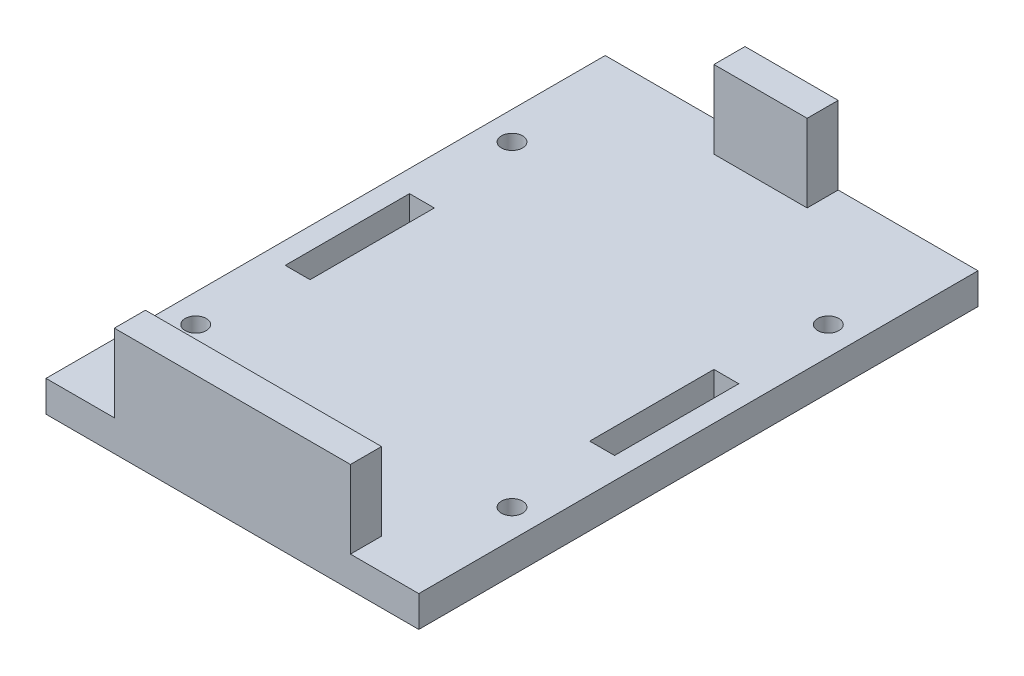
ISO-10303-21;
HEADER;
FILE_DESCRIPTION(('STEP AP214'),'2;1');
FILE_NAME('part.step','',(''),(''),'','','');
FILE_SCHEMA(('AUTOMOTIVE_DESIGN { 1 0 10303 214 1 1 1 1 }'));
ENDSEC;
DATA;
#1=APPLICATION_CONTEXT('core data for automotive mechanical design processes');
#2=APPLICATION_PROTOCOL_DEFINITION('international standard','automotive_design',2000,#1);
#3=PRODUCT_CONTEXT('',#1,'mechanical');
#4=PRODUCT('Part','Part','',(#3));
#5=PRODUCT_RELATED_PRODUCT_CATEGORY('part','',(#4));
#6=PRODUCT_DEFINITION_FORMATION('','',#4);
#7=PRODUCT_DEFINITION_CONTEXT('part definition',#1,'design');
#8=PRODUCT_DEFINITION('design','',#6,#7);
#9=PRODUCT_DEFINITION_SHAPE('','',#8);
#10=(LENGTH_UNIT() NAMED_UNIT(*) SI_UNIT(.MILLI.,.METRE.));
#11=(NAMED_UNIT(*) PLANE_ANGLE_UNIT() SI_UNIT($,.RADIAN.));
#12=(NAMED_UNIT(*) SI_UNIT($,.STERADIAN.) SOLID_ANGLE_UNIT());
#13=UNCERTAINTY_MEASURE_WITH_UNIT(LENGTH_MEASURE(1.E-05),#10,'distance_accuracy_value','');
#14=(GEOMETRIC_REPRESENTATION_CONTEXT(3) GLOBAL_UNCERTAINTY_ASSIGNED_CONTEXT((#13)) GLOBAL_UNIT_ASSIGNED_CONTEXT((#10,
#11,#12)) REPRESENTATION_CONTEXT('',''));
#15=CARTESIAN_POINT('',(0.,0.,0.));
#16=DIRECTION('',(0.,0.,1.));
#17=DIRECTION('',(1.,0.,0.));
#18=AXIS2_PLACEMENT_3D('',#15,#16,#17);
#19=CARTESIAN_POINT('',(0.,2.5,0.));
#20=DIRECTION('',(0.,-1.,0.));
#21=DIRECTION('',(0.,0.,-1.));
#22=AXIS2_PLACEMENT_3D('',#19,#20,#21);
#23=PLANE('',#22);
#24=CARTESIAN_POINT('',(25.4558441227157,2.5,-25.4558441227157));
#25=DIRECTION('',(0.,1.,0.));
#26=DIRECTION('',(0.,0.,1.));
#27=AXIS2_PLACEMENT_3D('',#24,#25,#26);
#28=CIRCLE('',#27,1.69999999999999);
#29=CARTESIAN_POINT('',(25.4558441227157,2.5,-23.7558441227157));
#30=VERTEX_POINT('',#29);
#31=EDGE_CURVE('E272',#30,#30,#28,.T.);
#32=ORIENTED_EDGE('',*,*,#31,.F.);
#33=EDGE_LOOP('',(#32));
#34=FACE_BOUND('',#33,.T.);
#35=DIRECTION('',(0.,0.,1.));
#36=VECTOR('',#35,1.);
#37=CARTESIAN_POINT('',(-26.5,2.5,-10.));
#38=LINE('',#37,#36);
#39=CARTESIAN_POINT('',(-26.5,2.5,-10.));
#40=VERTEX_POINT('',#39);
#41=CARTESIAN_POINT('',(-26.5,2.5,10.));
#42=VERTEX_POINT('',#41);
#43=EDGE_CURVE('E324',#40,#42,#38,.T.);
#44=ORIENTED_EDGE('',*,*,#43,.F.);
#45=DIRECTION('',(-1.,0.,0.));
#46=VECTOR('',#45,1.);
#47=CARTESIAN_POINT('',(-26.5,2.5,-10.));
#48=LINE('',#47,#46);
#49=CARTESIAN_POINT('',(-22.5,2.5,-10.));
#50=VERTEX_POINT('',#49);
#51=EDGE_CURVE('E335',#50,#40,#48,.T.);
#52=ORIENTED_EDGE('',*,*,#51,.F.);
#53=DIRECTION('',(0.,0.,-1.));
#54=VECTOR('',#53,1.);
#55=CARTESIAN_POINT('',(-22.5,2.5,-10.));
#56=LINE('',#55,#54);
#57=CARTESIAN_POINT('',(-22.5,2.5,10.));
#58=VERTEX_POINT('',#57);
#59=EDGE_CURVE('E331',#58,#50,#56,.T.);
#60=ORIENTED_EDGE('',*,*,#59,.F.);
#61=DIRECTION('',(1.,0.,0.));
#62=VECTOR('',#61,1.);
#63=CARTESIAN_POINT('',(-26.5,2.5,10.));
#64=LINE('',#63,#62);
#65=EDGE_CURVE('E327',#42,#58,#64,.T.);
#66=ORIENTED_EDGE('',*,*,#65,.F.);
#67=EDGE_LOOP('',(#44,#52,#60,#66));
#68=FACE_BOUND('',#67,.T.);
#69=DIRECTION('',(0.,0.,-1.));
#70=VECTOR('',#69,1.);
#71=CARTESIAN_POINT('',(26.5,2.5,-10.));
#72=LINE('',#71,#70);
#73=CARTESIAN_POINT('',(26.5,2.5,10.));
#74=VERTEX_POINT('',#73);
#75=CARTESIAN_POINT('',(26.5,2.5,-10.));
#76=VERTEX_POINT('',#75);
#77=EDGE_CURVE('E281',#74,#76,#72,.T.);
#78=ORIENTED_EDGE('',*,*,#77,.F.);
#79=DIRECTION('',(1.,0.,0.));
#80=VECTOR('',#79,1.);
#81=CARTESIAN_POINT('',(26.5,2.5,10.));
#82=LINE('',#81,#80);
#83=CARTESIAN_POINT('',(22.5,2.5,10.));
#84=VERTEX_POINT('',#83);
#85=EDGE_CURVE('E292',#84,#74,#82,.T.);
#86=ORIENTED_EDGE('',*,*,#85,.F.);
#87=DIRECTION('',(0.,0.,1.));
#88=VECTOR('',#87,1.);
#89=CARTESIAN_POINT('',(22.5,2.5,-10.));
#90=LINE('',#89,#88);
#91=CARTESIAN_POINT('',(22.5,2.5,-10.));
#92=VERTEX_POINT('',#91);
#93=EDGE_CURVE('E288',#92,#84,#90,.T.);
#94=ORIENTED_EDGE('',*,*,#93,.F.);
#95=DIRECTION('',(-1.,0.,0.));
#96=VECTOR('',#95,1.);
#97=CARTESIAN_POINT('',(26.5,2.5,-10.));
#98=LINE('',#97,#96);
#99=EDGE_CURVE('E284',#76,#92,#98,.T.);
#100=ORIENTED_EDGE('',*,*,#99,.F.);
#101=EDGE_LOOP('',(#78,#86,#94,#100));
#102=FACE_BOUND('',#101,.T.);
#103=CARTESIAN_POINT('',(-25.4558441227157,2.5,-25.4558441227157));
#104=DIRECTION('',(0.,1.,0.));
#105=DIRECTION('',(0.,0.,1.));
#106=AXIS2_PLACEMENT_3D('',#103,#104,#105);
#107=CIRCLE('',#106,1.69999999999999);
#108=CARTESIAN_POINT('',(-25.4558441227157,2.5,-23.7558441227157));
#109=VERTEX_POINT('',#108);
#110=EDGE_CURVE('E264',#109,#109,#107,.T.);
#111=ORIENTED_EDGE('',*,*,#110,.F.);
#112=EDGE_LOOP('',(#111));
#113=FACE_BOUND('',#112,.T.);
#114=CARTESIAN_POINT('',(-25.4558441227157,2.5,25.4558441227157));
#115=DIRECTION('',(0.,1.,0.));
#116=DIRECTION('',(0.,0.,1.));
#117=AXIS2_PLACEMENT_3D('',#114,#115,#116);
#118=CIRCLE('',#117,1.69999999999999);
#119=CARTESIAN_POINT('',(-25.4558441227157,2.5,27.1558441227157));
#120=VERTEX_POINT('',#119);
#121=EDGE_CURVE('E256',#120,#120,#118,.T.);
#122=ORIENTED_EDGE('',*,*,#121,.F.);
#123=EDGE_LOOP('',(#122));
#124=FACE_BOUND('',#123,.T.);
#125=CARTESIAN_POINT('',(25.4558441227157,2.5,25.4558441227157));
#126=DIRECTION('',(0.,1.,0.));
#127=DIRECTION('',(0.,0.,1.));
#128=AXIS2_PLACEMENT_3D('',#125,#126,#127);
#129=CIRCLE('',#128,1.69999999999999);
#130=CARTESIAN_POINT('',(25.4558441227157,2.5,27.1558441227157));
#131=VERTEX_POINT('',#130);
#132=EDGE_CURVE('E248',#131,#131,#129,.T.);
#133=ORIENTED_EDGE('',*,*,#132,.F.);
#134=EDGE_LOOP('',(#133));
#135=FACE_BOUND('',#134,.T.);
#136=DIRECTION('',(0.,0.,1.));
#137=VECTOR('',#136,1.);
#138=CARTESIAN_POINT('',(-7.5,2.5,-40.));
#139=LINE('',#138,#137);
#140=CARTESIAN_POINT('',(-7.5,2.5,-45.));
#141=VERTEX_POINT('',#140);
#142=CARTESIAN_POINT('',(-7.5,2.5,-40.));
#143=VERTEX_POINT('',#142);
#144=EDGE_CURVE('E199',#141,#143,#139,.T.);
#145=ORIENTED_EDGE('',*,*,#144,.F.);
#146=DIRECTION('',(-1.,0.,0.));
#147=VECTOR('',#146,1.);
#148=CARTESIAN_POINT('',(-30.,2.5,-45.));
#149=LINE('',#148,#147);
#150=CARTESIAN_POINT('',(-30.,2.5,-45.));
#151=VERTEX_POINT('',#150);
#152=EDGE_CURVE('E371',#141,#151,#149,.T.);
#153=ORIENTED_EDGE('',*,*,#152,.T.);
#154=DIRECTION('',(0.,0.,1.));
#155=VECTOR('',#154,1.);
#156=CARTESIAN_POINT('',(-30.,2.5,45.));
#157=LINE('',#156,#155);
#158=CARTESIAN_POINT('',(-30.,2.5,45.));
#159=VERTEX_POINT('',#158);
#160=EDGE_CURVE('E376',#151,#159,#157,.T.);
#161=ORIENTED_EDGE('',*,*,#160,.T.);
#162=DIRECTION('',(1.,0.,0.));
#163=VECTOR('',#162,1.);
#164=CARTESIAN_POINT('',(-30.,2.5,45.));
#165=LINE('',#164,#163);
#166=CARTESIAN_POINT('',(-19.,2.5,45.));
#167=VERTEX_POINT('',#166);
#168=EDGE_CURVE('E380',#159,#167,#165,.T.);
#169=ORIENTED_EDGE('',*,*,#168,.T.);
#170=DIRECTION('',(0.,0.,1.));
#171=VECTOR('',#170,1.);
#172=CARTESIAN_POINT('',(-19.,2.5,40.));
#173=LINE('',#172,#171);
#174=CARTESIAN_POINT('',(-19.,2.5,40.));
#175=VERTEX_POINT('',#174);
#176=EDGE_CURVE('E201',#175,#167,#173,.T.);
#177=ORIENTED_EDGE('',*,*,#176,.F.);
#178=DIRECTION('',(-1.,0.,0.));
#179=VECTOR('',#178,1.);
#180=CARTESIAN_POINT('',(-19.,2.5,40.));
#181=LINE('',#180,#179);
#182=CARTESIAN_POINT('',(19.,2.5,40.));
#183=VERTEX_POINT('',#182);
#184=EDGE_CURVE('E217',#183,#175,#181,.T.);
#185=ORIENTED_EDGE('',*,*,#184,.F.);
#186=DIRECTION('',(0.,0.,-1.));
#187=VECTOR('',#186,1.);
#188=CARTESIAN_POINT('',(19.,2.5,40.));
#189=LINE('',#188,#187);
#190=CARTESIAN_POINT('',(19.,2.5,45.));
#191=VERTEX_POINT('',#190);
#192=EDGE_CURVE('E206',#191,#183,#189,.T.);
#193=ORIENTED_EDGE('',*,*,#192,.F.);
#194=CARTESIAN_POINT('',(30.,2.5,45.));
#195=VERTEX_POINT('',#194);
#196=EDGE_CURVE('E379',#191,#195,#165,.T.);
#197=ORIENTED_EDGE('',*,*,#196,.T.);
#198=DIRECTION('',(0.,0.,-1.));
#199=VECTOR('',#198,1.);
#200=CARTESIAN_POINT('',(30.,2.5,45.));
#201=LINE('',#200,#199);
#202=CARTESIAN_POINT('',(30.,2.5,-45.));
#203=VERTEX_POINT('',#202);
#204=EDGE_CURVE('E367',#195,#203,#201,.T.);
#205=ORIENTED_EDGE('',*,*,#204,.T.);
#206=CARTESIAN_POINT('',(7.49999999999998,2.5,-45.));
#207=VERTEX_POINT('',#206);
#208=EDGE_CURVE('E373',#203,#207,#149,.T.);
#209=ORIENTED_EDGE('',*,*,#208,.T.);
#210=DIRECTION('',(0.,0.,-1.));
#211=VECTOR('',#210,1.);
#212=CARTESIAN_POINT('',(7.5,2.5,-40.));
#213=LINE('',#212,#211);
#214=CARTESIAN_POINT('',(7.5,2.5,-40.));
#215=VERTEX_POINT('',#214);
#216=EDGE_CURVE('E60',#215,#207,#213,.T.);
#217=ORIENTED_EDGE('',*,*,#216,.F.);
#218=DIRECTION('',(1.,0.,0.));
#219=VECTOR('',#218,1.);
#220=CARTESIAN_POINT('',(-7.5,2.5,-40.));
#221=LINE('',#220,#219);
#222=EDGE_CURVE('E55',#143,#215,#221,.T.);
#223=ORIENTED_EDGE('',*,*,#222,.F.);
#224=EDGE_LOOP('',(#145,#153,#161,#169,#177,#185,#193,#197,#205,#209,#217,#223));
#225=FACE_BOUND('',#224,.T.);
#226=ADVANCED_FACE('F39',(#34,#68,#102,#113,#124,#135,#225),#23,.F.);
#227=CARTESIAN_POINT('',(0.,-2.5,0.));
#228=DIRECTION('',(0.,-1.,0.));
#229=DIRECTION('',(0.,0.,-1.));
#230=AXIS2_PLACEMENT_3D('',#227,#228,#229);
#231=PLANE('',#230);
#232=CARTESIAN_POINT('',(25.4558441227157,-2.5,25.4558441227157));
#233=DIRECTION('',(0.,-1.,0.));
#234=DIRECTION('',(0.,0.,-1.));
#235=AXIS2_PLACEMENT_3D('',#232,#233,#234);
#236=CIRCLE('',#235,1.69999999999999);
#237=CARTESIAN_POINT('',(25.4558441227157,-2.5,23.7558441227157));
#238=VERTEX_POINT('',#237);
#239=EDGE_CURVE('E252',#238,#238,#236,.T.);
#240=ORIENTED_EDGE('',*,*,#239,.F.);
#241=EDGE_LOOP('',(#240));
#242=FACE_BOUND('',#241,.T.);
#243=CARTESIAN_POINT('',(-25.4558441227157,-2.5,25.4558441227157));
#244=DIRECTION('',(0.,-1.,0.));
#245=DIRECTION('',(0.,0.,-1.));
#246=AXIS2_PLACEMENT_3D('',#243,#244,#245);
#247=CIRCLE('',#246,1.69999999999999);
#248=CARTESIAN_POINT('',(-25.4558441227157,-2.5,23.7558441227157));
#249=VERTEX_POINT('',#248);
#250=EDGE_CURVE('E260',#249,#249,#247,.T.);
#251=ORIENTED_EDGE('',*,*,#250,.F.);
#252=EDGE_LOOP('',(#251));
#253=FACE_BOUND('',#252,.T.);
#254=CARTESIAN_POINT('',(-25.4558441227157,-2.5,-25.4558441227157));
#255=DIRECTION('',(0.,-1.,0.));
#256=DIRECTION('',(0.,0.,-1.));
#257=AXIS2_PLACEMENT_3D('',#254,#255,#256);
#258=CIRCLE('',#257,1.69999999999999);
#259=CARTESIAN_POINT('',(-25.4558441227157,-2.5,-27.1558441227157));
#260=VERTEX_POINT('',#259);
#261=EDGE_CURVE('E268',#260,#260,#258,.T.);
#262=ORIENTED_EDGE('',*,*,#261,.F.);
#263=EDGE_LOOP('',(#262));
#264=FACE_BOUND('',#263,.T.);
#265=CARTESIAN_POINT('',(25.4558441227157,-2.5,-25.4558441227157));
#266=DIRECTION('',(0.,-1.,0.));
#267=DIRECTION('',(0.,0.,-1.));
#268=AXIS2_PLACEMENT_3D('',#265,#266,#267);
#269=CIRCLE('',#268,1.69999999999999);
#270=CARTESIAN_POINT('',(25.4558441227157,-2.5,-27.1558441227157));
#271=VERTEX_POINT('',#270);
#272=EDGE_CURVE('E276',#271,#271,#269,.T.);
#273=ORIENTED_EDGE('',*,*,#272,.F.);
#274=EDGE_LOOP('',(#273));
#275=FACE_BOUND('',#274,.T.);
#276=DIRECTION('',(0.,0.,-1.));
#277=VECTOR('',#276,1.);
#278=CARTESIAN_POINT('',(30.,-2.5,45.));
#279=LINE('',#278,#277);
#280=CARTESIAN_POINT('',(30.,-2.5,45.));
#281=VERTEX_POINT('',#280);
#282=CARTESIAN_POINT('',(30.,-2.5,-45.));
#283=VERTEX_POINT('',#282);
#284=EDGE_CURVE('E366',#281,#283,#279,.T.);
#285=ORIENTED_EDGE('',*,*,#284,.F.);
#286=DIRECTION('',(1.,0.,0.));
#287=VECTOR('',#286,1.);
#288=CARTESIAN_POINT('',(-30.,-2.5,45.));
#289=LINE('',#288,#287);
#290=CARTESIAN_POINT('',(-30.,-2.5,45.));
#291=VERTEX_POINT('',#290);
#292=EDGE_CURVE('E372',#291,#281,#289,.T.);
#293=ORIENTED_EDGE('',*,*,#292,.F.);
#294=DIRECTION('',(0.,0.,1.));
#295=VECTOR('',#294,1.);
#296=CARTESIAN_POINT('',(-30.,-2.5,45.));
#297=LINE('',#296,#295);
#298=CARTESIAN_POINT('',(-30.,-2.5,-45.));
#299=VERTEX_POINT('',#298);
#300=EDGE_CURVE('E390',#299,#291,#297,.T.);
#301=ORIENTED_EDGE('',*,*,#300,.F.);
#302=DIRECTION('',(-1.,0.,0.));
#303=VECTOR('',#302,1.);
#304=CARTESIAN_POINT('',(-30.,-2.5,-45.));
#305=LINE('',#304,#303);
#306=EDGE_CURVE('E387',#283,#299,#305,.T.);
#307=ORIENTED_EDGE('',*,*,#306,.F.);
#308=EDGE_LOOP('',(#285,#293,#301,#307));
#309=FACE_BOUND('',#308,.T.);
#310=DIRECTION('',(-1.,0.,0.));
#311=VECTOR('',#310,1.);
#312=CARTESIAN_POINT('',(-26.5,-2.5,-10.));
#313=LINE('',#312,#311);
#314=CARTESIAN_POINT('',(-22.5,-2.5,-10.));
#315=VERTEX_POINT('',#314);
#316=CARTESIAN_POINT('',(-26.5,-2.5,-10.));
#317=VERTEX_POINT('',#316);
#318=EDGE_CURVE('E328',#315,#317,#313,.T.);
#319=ORIENTED_EDGE('',*,*,#318,.T.);
#320=DIRECTION('',(0.,0.,1.));
#321=VECTOR('',#320,1.);
#322=CARTESIAN_POINT('',(-26.5,-2.5,-10.));
#323=LINE('',#322,#321);
#324=CARTESIAN_POINT('',(-26.5,-2.5,10.));
#325=VERTEX_POINT('',#324);
#326=EDGE_CURVE('E323',#317,#325,#323,.T.);
#327=ORIENTED_EDGE('',*,*,#326,.T.);
#328=DIRECTION('',(1.,0.,0.));
#329=VECTOR('',#328,1.);
#330=CARTESIAN_POINT('',(-26.5,-2.5,10.));
#331=LINE('',#330,#329);
#332=CARTESIAN_POINT('',(-22.5,-2.5,10.));
#333=VERTEX_POINT('',#332);
#334=EDGE_CURVE('E342',#325,#333,#331,.T.);
#335=ORIENTED_EDGE('',*,*,#334,.T.);
#336=DIRECTION('',(0.,0.,-1.));
#337=VECTOR('',#336,1.);
#338=CARTESIAN_POINT('',(-22.5,-2.5,-10.));
#339=LINE('',#338,#337);
#340=EDGE_CURVE('E346',#333,#315,#339,.T.);
#341=ORIENTED_EDGE('',*,*,#340,.T.);
#342=EDGE_LOOP('',(#319,#327,#335,#341));
#343=FACE_BOUND('',#342,.T.);
#344=DIRECTION('',(1.,0.,0.));
#345=VECTOR('',#344,1.);
#346=CARTESIAN_POINT('',(26.5,-2.5,10.));
#347=LINE('',#346,#345);
#348=CARTESIAN_POINT('',(22.5,-2.5,10.));
#349=VERTEX_POINT('',#348);
#350=CARTESIAN_POINT('',(26.5,-2.5,10.));
#351=VERTEX_POINT('',#350);
#352=EDGE_CURVE('E285',#349,#351,#347,.T.);
#353=ORIENTED_EDGE('',*,*,#352,.T.);
#354=DIRECTION('',(0.,0.,-1.));
#355=VECTOR('',#354,1.);
#356=CARTESIAN_POINT('',(26.5,-2.5,-10.));
#357=LINE('',#356,#355);
#358=CARTESIAN_POINT('',(26.5,-2.5,-10.));
#359=VERTEX_POINT('',#358);
#360=EDGE_CURVE('E280',#351,#359,#357,.T.);
#361=ORIENTED_EDGE('',*,*,#360,.T.);
#362=DIRECTION('',(-1.,0.,0.));
#363=VECTOR('',#362,1.);
#364=CARTESIAN_POINT('',(26.5,-2.5,-10.));
#365=LINE('',#364,#363);
#366=CARTESIAN_POINT('',(22.5,-2.5,-10.));
#367=VERTEX_POINT('',#366);
#368=EDGE_CURVE('E299',#359,#367,#365,.T.);
#369=ORIENTED_EDGE('',*,*,#368,.T.);
#370=DIRECTION('',(0.,0.,1.));
#371=VECTOR('',#370,1.);
#372=CARTESIAN_POINT('',(22.5,-2.5,-10.));
#373=LINE('',#372,#371);
#374=EDGE_CURVE('E303',#367,#349,#373,.T.);
#375=ORIENTED_EDGE('',*,*,#374,.T.);
#376=EDGE_LOOP('',(#353,#361,#369,#375));
#377=FACE_BOUND('',#376,.T.);
#378=ADVANCED_FACE('F413',(#242,#253,#264,#275,#309,#343,#377),#231,.T.);
#379=CARTESIAN_POINT('',(30.,2.5,45.));
#380=DIRECTION('',(-1.,0.,0.));
#381=DIRECTION('',(0.,0.,1.));
#382=AXIS2_PLACEMENT_3D('',#379,#380,#381);
#383=PLANE('',#382);
#384=ORIENTED_EDGE('',*,*,#284,.T.);
#385=DIRECTION('',(0.,-1.,0.));
#386=VECTOR('',#385,1.);
#387=CARTESIAN_POINT('',(30.,2.5,-45.));
#388=LINE('',#387,#386);
#389=EDGE_CURVE('E11',#203,#283,#388,.T.);
#390=ORIENTED_EDGE('',*,*,#389,.F.);
#391=ORIENTED_EDGE('',*,*,#204,.F.);
#392=DIRECTION('',(0.,-1.,0.));
#393=VECTOR('',#392,1.);
#394=CARTESIAN_POINT('',(30.,2.5,45.));
#395=LINE('',#394,#393);
#396=EDGE_CURVE('E383',#195,#281,#395,.T.);
#397=ORIENTED_EDGE('',*,*,#396,.T.);
#398=EDGE_LOOP('',(#384,#390,#391,#397));
#399=FACE_BOUND('',#398,.T.);
#400=ADVANCED_FACE('F41',(#399),#383,.F.);
#401=CARTESIAN_POINT('',(-30.,2.5,-45.));
#402=DIRECTION('',(0.,0.,1.));
#403=DIRECTION('',(1.,0.,0.));
#404=AXIS2_PLACEMENT_3D('',#401,#402,#403);
#405=PLANE('',#404);
#406=ORIENTED_EDGE('',*,*,#306,.T.);
#407=DIRECTION('',(0.,-1.,0.));
#408=VECTOR('',#407,1.);
#409=CARTESIAN_POINT('',(-30.,2.5,-45.));
#410=LINE('',#409,#408);
#411=EDGE_CURVE('E48',#151,#299,#410,.T.);
#412=ORIENTED_EDGE('',*,*,#411,.F.);
#413=ORIENTED_EDGE('',*,*,#152,.F.);
#414=DIRECTION('',(0.,-1.,0.));
#415=VECTOR('',#414,1.);
#416=CARTESIAN_POINT('',(-7.5,15.,-45.));
#417=LINE('',#416,#415);
#418=CARTESIAN_POINT('',(-7.5,15.,-45.));
#419=VERTEX_POINT('',#418);
#420=EDGE_CURVE('E427',#419,#141,#417,.T.);
#421=ORIENTED_EDGE('',*,*,#420,.F.);
#422=DIRECTION('',(-1.,0.,0.));
#423=VECTOR('',#422,1.);
#424=CARTESIAN_POINT('',(-7.5,15.,-45.));
#425=LINE('',#424,#423);
#426=CARTESIAN_POINT('',(7.5,15.,-45.));
#427=VERTEX_POINT('',#426);
#428=EDGE_CURVE('E192',#427,#419,#425,.T.);
#429=ORIENTED_EDGE('',*,*,#428,.F.);
#430=DIRECTION('',(0.,-1.,0.));
#431=VECTOR('',#430,1.);
#432=CARTESIAN_POINT('',(7.5,15.,-45.));
#433=LINE('',#432,#431);
#434=EDGE_CURVE('E208',#427,#207,#433,.T.);
#435=ORIENTED_EDGE('',*,*,#434,.T.);
#436=ORIENTED_EDGE('',*,*,#208,.F.);
#437=ORIENTED_EDGE('',*,*,#389,.T.);
#438=EDGE_LOOP('',(#406,#412,#413,#421,#429,#435,#436,#437));
#439=FACE_BOUND('',#438,.T.);
#440=ADVANCED_FACE('F426',(#439),#405,.F.);
#441=CARTESIAN_POINT('',(-30.,2.5,45.));
#442=DIRECTION('',(1.,0.,0.));
#443=DIRECTION('',(0.,0.,-1.));
#444=AXIS2_PLACEMENT_3D('',#441,#442,#443);
#445=PLANE('',#444);
#446=ORIENTED_EDGE('',*,*,#300,.T.);
#447=DIRECTION('',(0.,-1.,0.));
#448=VECTOR('',#447,1.);
#449=CARTESIAN_POINT('',(-30.,2.5,45.));
#450=LINE('',#449,#448);
#451=EDGE_CURVE('E398',#159,#291,#450,.T.);
#452=ORIENTED_EDGE('',*,*,#451,.F.);
#453=ORIENTED_EDGE('',*,*,#160,.F.);
#454=ORIENTED_EDGE('',*,*,#411,.T.);
#455=EDGE_LOOP('',(#446,#452,#453,#454));
#456=FACE_BOUND('',#455,.T.);
#457=ADVANCED_FACE('F407',(#456),#445,.F.);
#458=CARTESIAN_POINT('',(-30.,2.5,45.));
#459=DIRECTION('',(0.,0.,-1.));
#460=DIRECTION('',(-1.,0.,0.));
#461=AXIS2_PLACEMENT_3D('',#458,#459,#460);
#462=PLANE('',#461);
#463=ORIENTED_EDGE('',*,*,#292,.T.);
#464=ORIENTED_EDGE('',*,*,#396,.F.);
#465=ORIENTED_EDGE('',*,*,#196,.F.);
#466=DIRECTION('',(0.,-1.,0.));
#467=VECTOR('',#466,1.);
#468=CARTESIAN_POINT('',(19.,15.,45.));
#469=LINE('',#468,#467);
#470=CARTESIAN_POINT('',(19.,15.,45.));
#471=VERTEX_POINT('',#470);
#472=EDGE_CURVE('E240',#471,#191,#469,.T.);
#473=ORIENTED_EDGE('',*,*,#472,.F.);
#474=DIRECTION('',(1.,0.,0.));
#475=VECTOR('',#474,1.);
#476=CARTESIAN_POINT('',(-19.,15.,45.));
#477=LINE('',#476,#475);
#478=CARTESIAN_POINT('',(-19.,15.,45.));
#479=VERTEX_POINT('',#478);
#480=EDGE_CURVE('E216',#479,#471,#477,.T.);
#481=ORIENTED_EDGE('',*,*,#480,.F.);
#482=DIRECTION('',(0.,-1.,0.));
#483=VECTOR('',#482,1.);
#484=CARTESIAN_POINT('',(-19.,15.,45.));
#485=LINE('',#484,#483);
#486=EDGE_CURVE('E244',#479,#167,#485,.T.);
#487=ORIENTED_EDGE('',*,*,#486,.T.);
#488=ORIENTED_EDGE('',*,*,#168,.F.);
#489=ORIENTED_EDGE('',*,*,#451,.T.);
#490=EDGE_LOOP('',(#463,#464,#465,#473,#481,#487,#488,#489));
#491=FACE_BOUND('',#490,.T.);
#492=ADVANCED_FACE('F417',(#491),#462,.F.);
#493=CARTESIAN_POINT('',(-26.5,2.5,-10.));
#494=DIRECTION('',(1.,0.,0.));
#495=DIRECTION('',(0.,0.,-1.));
#496=AXIS2_PLACEMENT_3D('',#493,#494,#495);
#497=PLANE('',#496);
#498=ORIENTED_EDGE('',*,*,#326,.F.);
#499=DIRECTION('',(0.,-1.,0.));
#500=VECTOR('',#499,1.);
#501=CARTESIAN_POINT('',(-26.5,2.5,-10.));
#502=LINE('',#501,#500);
#503=EDGE_CURVE('E338',#40,#317,#502,.T.);
#504=ORIENTED_EDGE('',*,*,#503,.F.);
#505=ORIENTED_EDGE('',*,*,#43,.T.);
#506=DIRECTION('',(0.,-1.,0.));
#507=VECTOR('',#506,1.);
#508=CARTESIAN_POINT('',(-26.5,2.5,10.));
#509=LINE('',#508,#507);
#510=EDGE_CURVE('E362',#42,#325,#509,.T.);
#511=ORIENTED_EDGE('',*,*,#510,.T.);
#512=EDGE_LOOP('',(#498,#504,#505,#511));
#513=FACE_BOUND('',#512,.T.);
#514=ADVANCED_FACE('F464',(#513),#497,.T.);
#515=CARTESIAN_POINT('',(-26.5,2.5,10.));
#516=DIRECTION('',(0.,0.,-1.));
#517=DIRECTION('',(-1.,0.,0.));
#518=AXIS2_PLACEMENT_3D('',#515,#516,#517);
#519=PLANE('',#518);
#520=ORIENTED_EDGE('',*,*,#334,.F.);
#521=ORIENTED_EDGE('',*,*,#510,.F.);
#522=ORIENTED_EDGE('',*,*,#65,.T.);
#523=DIRECTION('',(0.,-1.,0.));
#524=VECTOR('',#523,1.);
#525=CARTESIAN_POINT('',(-22.5,2.5,10.));
#526=LINE('',#525,#524);
#527=EDGE_CURVE('E359',#58,#333,#526,.T.);
#528=ORIENTED_EDGE('',*,*,#527,.T.);
#529=EDGE_LOOP('',(#520,#521,#522,#528));
#530=FACE_BOUND('',#529,.T.);
#531=ADVANCED_FACE('F633',(#530),#519,.T.);
#532=CARTESIAN_POINT('',(-22.5,2.5,-10.));
#533=DIRECTION('',(-1.,0.,0.));
#534=DIRECTION('',(0.,0.,1.));
#535=AXIS2_PLACEMENT_3D('',#532,#533,#534);
#536=PLANE('',#535);
#537=ORIENTED_EDGE('',*,*,#340,.F.);
#538=ORIENTED_EDGE('',*,*,#527,.F.);
#539=ORIENTED_EDGE('',*,*,#59,.T.);
#540=DIRECTION('',(0.,-1.,0.));
#541=VECTOR('',#540,1.);
#542=CARTESIAN_POINT('',(-22.5,2.5,-10.));
#543=LINE('',#542,#541);
#544=EDGE_CURVE('E356',#50,#315,#543,.T.);
#545=ORIENTED_EDGE('',*,*,#544,.T.);
#546=EDGE_LOOP('',(#537,#538,#539,#545));
#547=FACE_BOUND('',#546,.T.);
#548=ADVANCED_FACE('F630',(#547),#536,.T.);
#549=CARTESIAN_POINT('',(-26.5,2.5,-10.));
#550=DIRECTION('',(0.,0.,1.));
#551=DIRECTION('',(1.,0.,0.));
#552=AXIS2_PLACEMENT_3D('',#549,#550,#551);
#553=PLANE('',#552);
#554=ORIENTED_EDGE('',*,*,#318,.F.);
#555=ORIENTED_EDGE('',*,*,#544,.F.);
#556=ORIENTED_EDGE('',*,*,#51,.T.);
#557=ORIENTED_EDGE('',*,*,#503,.T.);
#558=EDGE_LOOP('',(#554,#555,#556,#557));
#559=FACE_BOUND('',#558,.T.);
#560=ADVANCED_FACE('F626',(#559),#553,.T.);
#561=CARTESIAN_POINT('',(26.5,2.5,-10.));
#562=DIRECTION('',(-1.,0.,0.));
#563=DIRECTION('',(0.,0.,1.));
#564=AXIS2_PLACEMENT_3D('',#561,#562,#563);
#565=PLANE('',#564);
#566=ORIENTED_EDGE('',*,*,#360,.F.);
#567=DIRECTION('',(0.,-1.,0.));
#568=VECTOR('',#567,1.);
#569=CARTESIAN_POINT('',(26.5,2.5,10.));
#570=LINE('',#569,#568);
#571=EDGE_CURVE('E295',#74,#351,#570,.T.);
#572=ORIENTED_EDGE('',*,*,#571,.F.);
#573=ORIENTED_EDGE('',*,*,#77,.T.);
#574=DIRECTION('',(0.,-1.,0.));
#575=VECTOR('',#574,1.);
#576=CARTESIAN_POINT('',(26.5,2.5,-10.));
#577=LINE('',#576,#575);
#578=EDGE_CURVE('E319',#76,#359,#577,.T.);
#579=ORIENTED_EDGE('',*,*,#578,.T.);
#580=EDGE_LOOP('',(#566,#572,#573,#579));
#581=FACE_BOUND('',#580,.T.);
#582=ADVANCED_FACE('F622',(#581),#565,.T.);
#583=CARTESIAN_POINT('',(26.5,2.5,-10.));
#584=DIRECTION('',(0.,0.,1.));
#585=DIRECTION('',(1.,0.,0.));
#586=AXIS2_PLACEMENT_3D('',#583,#584,#585);
#587=PLANE('',#586);
#588=ORIENTED_EDGE('',*,*,#368,.F.);
#589=ORIENTED_EDGE('',*,*,#578,.F.);
#590=ORIENTED_EDGE('',*,*,#99,.T.);
#591=DIRECTION('',(0.,-1.,0.));
#592=VECTOR('',#591,1.);
#593=CARTESIAN_POINT('',(22.5,2.5,-10.));
#594=LINE('',#593,#592);
#595=EDGE_CURVE('E316',#92,#367,#594,.T.);
#596=ORIENTED_EDGE('',*,*,#595,.T.);
#597=EDGE_LOOP('',(#588,#589,#590,#596));
#598=FACE_BOUND('',#597,.T.);
#599=ADVANCED_FACE('F618',(#598),#587,.T.);
#600=CARTESIAN_POINT('',(22.5,2.5,-10.));
#601=DIRECTION('',(1.,0.,0.));
#602=DIRECTION('',(0.,0.,-1.));
#603=AXIS2_PLACEMENT_3D('',#600,#601,#602);
#604=PLANE('',#603);
#605=ORIENTED_EDGE('',*,*,#374,.F.);
#606=ORIENTED_EDGE('',*,*,#595,.F.);
#607=ORIENTED_EDGE('',*,*,#93,.T.);
#608=DIRECTION('',(0.,-1.,0.));
#609=VECTOR('',#608,1.);
#610=CARTESIAN_POINT('',(22.5,2.5,10.));
#611=LINE('',#610,#609);
#612=EDGE_CURVE('E313',#84,#349,#611,.T.);
#613=ORIENTED_EDGE('',*,*,#612,.T.);
#614=EDGE_LOOP('',(#605,#606,#607,#613));
#615=FACE_BOUND('',#614,.T.);
#616=ADVANCED_FACE('F614',(#615),#604,.T.);
#617=CARTESIAN_POINT('',(26.5,2.5,10.));
#618=DIRECTION('',(0.,0.,-1.));
#619=DIRECTION('',(-1.,0.,0.));
#620=AXIS2_PLACEMENT_3D('',#617,#618,#619);
#621=PLANE('',#620);
#622=ORIENTED_EDGE('',*,*,#352,.F.);
#623=ORIENTED_EDGE('',*,*,#612,.F.);
#624=ORIENTED_EDGE('',*,*,#85,.T.);
#625=ORIENTED_EDGE('',*,*,#571,.T.);
#626=EDGE_LOOP('',(#622,#623,#624,#625));
#627=FACE_BOUND('',#626,.T.);
#628=ADVANCED_FACE('F487',(#627),#621,.T.);
#629=CARTESIAN_POINT('',(25.4558441227157,2.5,-25.4558441227157));
#630=DIRECTION('',(0.,1.,0.));
#631=DIRECTION('',(0.,0.,1.));
#632=AXIS2_PLACEMENT_3D('',#629,#630,#631);
#633=CYLINDRICAL_SURFACE('',#632,1.69999999999999);
#634=ORIENTED_EDGE('',*,*,#31,.T.);
#635=EDGE_LOOP('',(#634));
#636=FACE_BOUND('',#635,.T.);
#637=ORIENTED_EDGE('',*,*,#272,.T.);
#638=EDGE_LOOP('',(#637));
#639=FACE_BOUND('',#638,.T.);
#640=ADVANCED_FACE('F492',(#636,#639),#633,.F.);
#641=CARTESIAN_POINT('',(-25.4558441227157,2.5,-25.4558441227157));
#642=DIRECTION('',(0.,1.,0.));
#643=DIRECTION('',(0.,0.,1.));
#644=AXIS2_PLACEMENT_3D('',#641,#642,#643);
#645=CYLINDRICAL_SURFACE('',#644,1.69999999999999);
#646=ORIENTED_EDGE('',*,*,#110,.T.);
#647=EDGE_LOOP('',(#646));
#648=FACE_BOUND('',#647,.T.);
#649=ORIENTED_EDGE('',*,*,#261,.T.);
#650=EDGE_LOOP('',(#649));
#651=FACE_BOUND('',#650,.T.);
#652=ADVANCED_FACE('F497',(#648,#651),#645,.F.);
#653=CARTESIAN_POINT('',(-25.4558441227157,2.5,25.4558441227157));
#654=DIRECTION('',(0.,1.,0.));
#655=DIRECTION('',(0.,0.,1.));
#656=AXIS2_PLACEMENT_3D('',#653,#654,#655);
#657=CYLINDRICAL_SURFACE('',#656,1.69999999999999);
#658=ORIENTED_EDGE('',*,*,#121,.T.);
#659=EDGE_LOOP('',(#658));
#660=FACE_BOUND('',#659,.T.);
#661=ORIENTED_EDGE('',*,*,#250,.T.);
#662=EDGE_LOOP('',(#661));
#663=FACE_BOUND('',#662,.T.);
#664=ADVANCED_FACE('F507',(#660,#663),#657,.F.);
#665=CARTESIAN_POINT('',(25.4558441227157,2.5,25.4558441227157));
#666=DIRECTION('',(0.,1.,0.));
#667=DIRECTION('',(0.,0.,1.));
#668=AXIS2_PLACEMENT_3D('',#665,#666,#667);
#669=CYLINDRICAL_SURFACE('',#668,1.69999999999999);
#670=ORIENTED_EDGE('',*,*,#132,.T.);
#671=EDGE_LOOP('',(#670));
#672=FACE_BOUND('',#671,.T.);
#673=ORIENTED_EDGE('',*,*,#239,.T.);
#674=EDGE_LOOP('',(#673));
#675=FACE_BOUND('',#674,.T.);
#676=ADVANCED_FACE('F517',(#672,#675),#669,.F.);
#677=CARTESIAN_POINT('',(-19.,15.,40.));
#678=DIRECTION('',(1.,0.,0.));
#679=DIRECTION('',(0.,0.,-1.));
#680=AXIS2_PLACEMENT_3D('',#677,#678,#679);
#681=PLANE('',#680);
#682=ORIENTED_EDGE('',*,*,#176,.T.);
#683=ORIENTED_EDGE('',*,*,#486,.F.);
#684=DIRECTION('',(0.,0.,1.));
#685=VECTOR('',#684,1.);
#686=CARTESIAN_POINT('',(-19.,15.,40.));
#687=LINE('',#686,#685);
#688=CARTESIAN_POINT('',(-19.,15.,40.));
#689=VERTEX_POINT('',#688);
#690=EDGE_CURVE('E212',#689,#479,#687,.T.);
#691=ORIENTED_EDGE('',*,*,#690,.F.);
#692=DIRECTION('',(0.,-1.,0.));
#693=VECTOR('',#692,1.);
#694=CARTESIAN_POINT('',(-19.,15.,40.));
#695=LINE('',#694,#693);
#696=EDGE_CURVE('E225',#689,#175,#695,.T.);
#697=ORIENTED_EDGE('',*,*,#696,.T.);
#698=EDGE_LOOP('',(#682,#683,#691,#697));
#699=FACE_BOUND('',#698,.T.);
#700=ADVANCED_FACE('F526',(#699),#681,.F.);
#701=CARTESIAN_POINT('',(19.,15.,40.));
#702=DIRECTION('',(-1.,0.,0.));
#703=DIRECTION('',(0.,0.,1.));
#704=AXIS2_PLACEMENT_3D('',#701,#702,#703);
#705=PLANE('',#704);
#706=ORIENTED_EDGE('',*,*,#192,.T.);
#707=DIRECTION('',(0.,-1.,0.));
#708=VECTOR('',#707,1.);
#709=CARTESIAN_POINT('',(19.,15.,40.));
#710=LINE('',#709,#708);
#711=CARTESIAN_POINT('',(19.,15.,40.));
#712=VERTEX_POINT('',#711);
#713=EDGE_CURVE('E236',#712,#183,#710,.T.);
#714=ORIENTED_EDGE('',*,*,#713,.F.);
#715=DIRECTION('',(0.,0.,-1.));
#716=VECTOR('',#715,1.);
#717=CARTESIAN_POINT('',(19.,15.,40.));
#718=LINE('',#717,#716);
#719=EDGE_CURVE('E220',#471,#712,#718,.T.);
#720=ORIENTED_EDGE('',*,*,#719,.F.);
#721=ORIENTED_EDGE('',*,*,#472,.T.);
#722=EDGE_LOOP('',(#706,#714,#720,#721));
#723=FACE_BOUND('',#722,.T.);
#724=ADVANCED_FACE('F554',(#723),#705,.F.);
#725=CARTESIAN_POINT('',(-19.,15.,40.));
#726=DIRECTION('',(0.,0.,1.));
#727=DIRECTION('',(1.,0.,0.));
#728=AXIS2_PLACEMENT_3D('',#725,#726,#727);
#729=PLANE('',#728);
#730=ORIENTED_EDGE('',*,*,#184,.T.);
#731=ORIENTED_EDGE('',*,*,#696,.F.);
#732=DIRECTION('',(-1.,0.,0.));
#733=VECTOR('',#732,1.);
#734=CARTESIAN_POINT('',(-19.,15.,40.));
#735=LINE('',#734,#733);
#736=EDGE_CURVE('E223',#712,#689,#735,.T.);
#737=ORIENTED_EDGE('',*,*,#736,.F.);
#738=ORIENTED_EDGE('',*,*,#713,.T.);
#739=EDGE_LOOP('',(#730,#731,#737,#738));
#740=FACE_BOUND('',#739,.T.);
#741=ADVANCED_FACE('F564',(#740),#729,.F.);
#742=CARTESIAN_POINT('',(0.,15.,0.));
#743=DIRECTION('',(0.,1.,0.));
#744=DIRECTION('',(0.,0.,1.));
#745=AXIS2_PLACEMENT_3D('',#742,#743,#744);
#746=PLANE('',#745);
#747=ORIENTED_EDGE('',*,*,#690,.T.);
#748=ORIENTED_EDGE('',*,*,#480,.T.);
#749=ORIENTED_EDGE('',*,*,#719,.T.);
#750=ORIENTED_EDGE('',*,*,#736,.T.);
#751=EDGE_LOOP('',(#747,#748,#749,#750));
#752=FACE_BOUND('',#751,.T.);
#753=ADVANCED_FACE('F574',(#752),#746,.T.);
#754=CARTESIAN_POINT('',(-7.5,15.,-40.));
#755=DIRECTION('',(1.,0.,0.));
#756=DIRECTION('',(0.,0.,-1.));
#757=AXIS2_PLACEMENT_3D('',#754,#755,#756);
#758=PLANE('',#757);
#759=ORIENTED_EDGE('',*,*,#144,.T.);
#760=DIRECTION('',(0.,-1.,0.));
#761=VECTOR('',#760,1.);
#762=CARTESIAN_POINT('',(-7.5,15.,-40.));
#763=LINE('',#762,#761);
#764=CARTESIAN_POINT('',(-7.5,15.,-40.));
#765=VERTEX_POINT('',#764);
#766=EDGE_CURVE('E179',#765,#143,#763,.T.);
#767=ORIENTED_EDGE('',*,*,#766,.F.);
#768=DIRECTION('',(0.,0.,1.));
#769=VECTOR('',#768,1.);
#770=CARTESIAN_POINT('',(-7.5,15.,-40.));
#771=LINE('',#770,#769);
#772=EDGE_CURVE('E187',#419,#765,#771,.T.);
#773=ORIENTED_EDGE('',*,*,#772,.F.);
#774=ORIENTED_EDGE('',*,*,#420,.T.);
#775=EDGE_LOOP('',(#759,#767,#773,#774));
#776=FACE_BOUND('',#775,.T.);
#777=ADVANCED_FACE('F198',(#776),#758,.F.);
#778=CARTESIAN_POINT('',(-7.5,15.,-40.));
#779=DIRECTION('',(0.,0.,-1.));
#780=DIRECTION('',(-1.,0.,0.));
#781=AXIS2_PLACEMENT_3D('',#778,#779,#780);
#782=PLANE('',#781);
#783=ORIENTED_EDGE('',*,*,#222,.T.);
#784=DIRECTION('',(0.,-1.,0.));
#785=VECTOR('',#784,1.);
#786=CARTESIAN_POINT('',(7.5,15.,-40.));
#787=LINE('',#786,#785);
#788=CARTESIAN_POINT('',(7.5,15.,-40.));
#789=VERTEX_POINT('',#788);
#790=EDGE_CURVE('E182',#789,#215,#787,.T.);
#791=ORIENTED_EDGE('',*,*,#790,.F.);
#792=DIRECTION('',(1.,0.,0.));
#793=VECTOR('',#792,1.);
#794=CARTESIAN_POINT('',(-7.5,15.,-40.));
#795=LINE('',#794,#793);
#796=EDGE_CURVE('E175',#765,#789,#795,.T.);
#797=ORIENTED_EDGE('',*,*,#796,.F.);
#798=ORIENTED_EDGE('',*,*,#766,.T.);
#799=EDGE_LOOP('',(#783,#791,#797,#798));
#800=FACE_BOUND('',#799,.T.);
#801=ADVANCED_FACE('F177',(#800),#782,.F.);
#802=CARTESIAN_POINT('',(7.5,15.,-40.));
#803=DIRECTION('',(-1.,0.,0.));
#804=DIRECTION('',(0.,0.,1.));
#805=AXIS2_PLACEMENT_3D('',#802,#803,#804);
#806=PLANE('',#805);
#807=ORIENTED_EDGE('',*,*,#216,.T.);
#808=ORIENTED_EDGE('',*,*,#434,.F.);
#809=DIRECTION('',(0.,0.,-1.));
#810=VECTOR('',#809,1.);
#811=CARTESIAN_POINT('',(7.5,15.,-40.));
#812=LINE('',#811,#810);
#813=EDGE_CURVE('E186',#789,#427,#812,.T.);
#814=ORIENTED_EDGE('',*,*,#813,.F.);
#815=ORIENTED_EDGE('',*,*,#790,.T.);
#816=EDGE_LOOP('',(#807,#808,#814,#815));
#817=FACE_BOUND('',#816,.T.);
#818=ADVANCED_FACE('F444',(#817),#806,.F.);
#819=CARTESIAN_POINT('',(0.,15.,0.));
#820=DIRECTION('',(0.,-1.,0.));
#821=DIRECTION('',(0.,0.,-1.));
#822=AXIS2_PLACEMENT_3D('',#819,#820,#821);
#823=PLANE('',#822);
#824=ORIENTED_EDGE('',*,*,#772,.T.);
#825=ORIENTED_EDGE('',*,*,#796,.T.);
#826=ORIENTED_EDGE('',*,*,#813,.T.);
#827=ORIENTED_EDGE('',*,*,#428,.T.);
#828=EDGE_LOOP('',(#824,#825,#826,#827));
#829=FACE_BOUND('',#828,.T.);
#830=ADVANCED_FACE('F190',(#829),#823,.F.);
#831=CLOSED_SHELL('',(#226,#378,#400,#440,#457,#492,#514,#531,#548,#560,#582,#599,#616,#628,
#640,#652,#664,#676,#700,#724,#741,#753,#777,#801,#818,#830));
#832=MANIFOLD_SOLID_BREP('B2',#831);
#833=ADVANCED_BREP_SHAPE_REPRESENTATION('',(#18,#832),#14);
#834=SHAPE_DEFINITION_REPRESENTATION(#9,#833);
ENDSEC;
END-ISO-10303-21;
